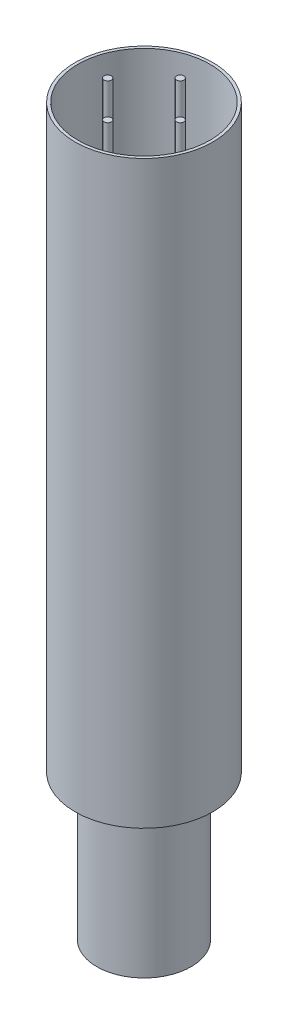
ISO-10303-21;
HEADER;
FILE_DESCRIPTION(('STEP AP214'),'2;1');
FILE_NAME('part.step','',(''),(''),'','','');
FILE_SCHEMA(('AUTOMOTIVE_DESIGN { 1 0 10303 214 1 1 1 1 }'));
ENDSEC;
DATA;
#1=APPLICATION_CONTEXT('core data for automotive mechanical design processes');
#2=APPLICATION_PROTOCOL_DEFINITION('international standard','automotive_design',2000,#1);
#3=PRODUCT_CONTEXT('',#1,'mechanical');
#4=PRODUCT('Part','Part','',(#3));
#5=PRODUCT_RELATED_PRODUCT_CATEGORY('part','',(#4));
#6=PRODUCT_DEFINITION_FORMATION('','',#4);
#7=PRODUCT_DEFINITION_CONTEXT('part definition',#1,'design');
#8=PRODUCT_DEFINITION('design','',#6,#7);
#9=PRODUCT_DEFINITION_SHAPE('','',#8);
#10=(LENGTH_UNIT() NAMED_UNIT(*) SI_UNIT(.MILLI.,.METRE.));
#11=(NAMED_UNIT(*) PLANE_ANGLE_UNIT() SI_UNIT($,.RADIAN.));
#12=(NAMED_UNIT(*) SI_UNIT($,.STERADIAN.) SOLID_ANGLE_UNIT());
#13=UNCERTAINTY_MEASURE_WITH_UNIT(LENGTH_MEASURE(1.E-05),#10,'distance_accuracy_value','');
#14=(GEOMETRIC_REPRESENTATION_CONTEXT(3) GLOBAL_UNCERTAINTY_ASSIGNED_CONTEXT((#13)) GLOBAL_UNIT_ASSIGNED_CONTEXT((#10,
#11,#12)) REPRESENTATION_CONTEXT('',''));
#15=CARTESIAN_POINT('',(0.,0.,0.));
#16=DIRECTION('',(0.,0.,1.));
#17=DIRECTION('',(1.,0.,0.));
#18=AXIS2_PLACEMENT_3D('',#15,#16,#17);
#19=CARTESIAN_POINT('',(-2.61861100413235E-13,502.,25.));
#20=DIRECTION('',(0.,-1.,0.));
#21=DIRECTION('',(0.,0.,-1.));
#22=AXIS2_PLACEMENT_3D('',#19,#20,#21);
#23=CYLINDRICAL_SURFACE('',#22,2.5);
#24=CARTESIAN_POINT('',(-2.61861100413235E-13,502.,25.));
#25=DIRECTION('',(0.,1.,0.));
#26=DIRECTION('',(0.,0.,1.));
#27=AXIS2_PLACEMENT_3D('',#24,#25,#26);
#28=CIRCLE('',#27,2.5);
#29=CARTESIAN_POINT('',(-2.61861100413235E-13,502.,27.5));
#30=VERTEX_POINT('',#29);
#31=EDGE_CURVE('E48',#30,#30,#28,.T.);
#32=ORIENTED_EDGE('',*,*,#31,.F.);
#33=EDGE_LOOP('',(#32));
#34=FACE_BOUND('',#33,.T.);
#35=CARTESIAN_POINT('',(-2.61861100413235E-13,102.,25.));
#36=DIRECTION('',(0.,1.,0.));
#37=DIRECTION('',(0.,0.,1.));
#38=AXIS2_PLACEMENT_3D('',#35,#36,#37);
#39=CIRCLE('',#38,2.5);
#40=CARTESIAN_POINT('',(-2.61861100413235E-13,102.,27.5));
#41=VERTEX_POINT('',#40);
#42=EDGE_CURVE('E11',#41,#41,#39,.T.);
#43=ORIENTED_EDGE('',*,*,#42,.T.);
#44=EDGE_LOOP('',(#43));
#45=FACE_BOUND('',#44,.T.);
#46=ADVANCED_FACE('F44',(#34,#45),#23,.T.);
#47=CARTESIAN_POINT('',(-2.61861100413235E-13,502.,25.));
#48=DIRECTION('',(0.,1.,0.));
#49=DIRECTION('',(0.,0.,1.));
#50=AXIS2_PLACEMENT_3D('',#47,#48,#49);
#51=PLANE('',#50);
#52=ORIENTED_EDGE('',*,*,#31,.T.);
#53=EDGE_LOOP('',(#52));
#54=FACE_BOUND('',#53,.T.);
#55=ADVANCED_FACE('F46',(#54),#51,.T.);
#56=CARTESIAN_POINT('',(-2.61861100413235E-13,102.,25.));
#57=DIRECTION('',(0.,1.,0.));
#58=DIRECTION('',(0.,0.,1.));
#59=AXIS2_PLACEMENT_3D('',#56,#57,#58);
#60=PLANE('',#59);
#61=ORIENTED_EDGE('',*,*,#42,.F.);
#62=EDGE_LOOP('',(#61));
#63=FACE_BOUND('',#62,.T.);
#64=ADVANCED_FACE('F63',(#63),#60,.F.);
#65=CLOSED_SHELL('',(#46,#55,#64));
#66=MANIFOLD_SOLID_BREP('B2',#65);
#67=CARTESIAN_POINT('',(25.,502.,1.74574066942157E-13));
#68=DIRECTION('',(0.,-1.,0.));
#69=DIRECTION('',(0.,0.,-1.));
#70=AXIS2_PLACEMENT_3D('',#67,#68,#69);
#71=CYLINDRICAL_SURFACE('',#70,2.5);
#72=CARTESIAN_POINT('',(25.,502.,1.74574066942157E-13));
#73=DIRECTION('',(0.,1.,0.));
#74=DIRECTION('',(0.,0.,1.));
#75=AXIS2_PLACEMENT_3D('',#72,#73,#74);
#76=CIRCLE('',#75,2.5);
#77=CARTESIAN_POINT('',(25.,502.,2.50000000000018));
#78=VERTEX_POINT('',#77);
#79=EDGE_CURVE('E103',#78,#78,#76,.T.);
#80=ORIENTED_EDGE('',*,*,#79,.F.);
#81=EDGE_LOOP('',(#80));
#82=FACE_BOUND('',#81,.T.);
#83=CARTESIAN_POINT('',(25.,102.,1.74574066942157E-13));
#84=DIRECTION('',(0.,1.,0.));
#85=DIRECTION('',(0.,0.,1.));
#86=AXIS2_PLACEMENT_3D('',#83,#84,#85);
#87=CIRCLE('',#86,2.5);
#88=CARTESIAN_POINT('',(25.,102.,2.50000000000018));
#89=VERTEX_POINT('',#88);
#90=EDGE_CURVE('E43',#89,#89,#87,.T.);
#91=ORIENTED_EDGE('',*,*,#90,.T.);
#92=EDGE_LOOP('',(#91));
#93=FACE_BOUND('',#92,.T.);
#94=ADVANCED_FACE('F99',(#82,#93),#71,.T.);
#95=CARTESIAN_POINT('',(25.,502.,1.74574066942157E-13));
#96=DIRECTION('',(0.,1.,0.));
#97=DIRECTION('',(0.,0.,1.));
#98=AXIS2_PLACEMENT_3D('',#95,#96,#97);
#99=PLANE('',#98);
#100=ORIENTED_EDGE('',*,*,#79,.T.);
#101=EDGE_LOOP('',(#100));
#102=FACE_BOUND('',#101,.T.);
#103=ADVANCED_FACE('F101',(#102),#99,.T.);
#104=CARTESIAN_POINT('',(25.,102.,1.74574066942157E-13));
#105=DIRECTION('',(0.,1.,0.));
#106=DIRECTION('',(0.,0.,1.));
#107=AXIS2_PLACEMENT_3D('',#104,#105,#106);
#108=PLANE('',#107);
#109=ORIENTED_EDGE('',*,*,#90,.F.);
#110=EDGE_LOOP('',(#109));
#111=FACE_BOUND('',#110,.T.);
#112=ADVANCED_FACE('F118',(#111),#108,.F.);
#113=CLOSED_SHELL('',(#94,#103,#112));
#114=MANIFOLD_SOLID_BREP('B6',#113);
#115=CARTESIAN_POINT('',(0.,502.,-25.));
#116=DIRECTION('',(0.,-1.,0.));
#117=DIRECTION('',(0.,0.,-1.));
#118=AXIS2_PLACEMENT_3D('',#115,#116,#117);
#119=CYLINDRICAL_SURFACE('',#118,2.5);
#120=CARTESIAN_POINT('',(0.,502.,-25.));
#121=DIRECTION('',(0.,1.,0.));
#122=DIRECTION('',(0.,0.,1.));
#123=AXIS2_PLACEMENT_3D('',#120,#121,#122);
#124=CIRCLE('',#123,2.5);
#125=CARTESIAN_POINT('',(0.,502.,-22.5));
#126=VERTEX_POINT('',#125);
#127=EDGE_CURVE('E158',#126,#126,#124,.T.);
#128=ORIENTED_EDGE('',*,*,#127,.F.);
#129=EDGE_LOOP('',(#128));
#130=FACE_BOUND('',#129,.T.);
#131=CARTESIAN_POINT('',(0.,102.,-25.));
#132=DIRECTION('',(0.,1.,0.));
#133=DIRECTION('',(0.,0.,1.));
#134=AXIS2_PLACEMENT_3D('',#131,#132,#133);
#135=CIRCLE('',#134,2.5);
#136=CARTESIAN_POINT('',(0.,102.,-22.5));
#137=VERTEX_POINT('',#136);
#138=EDGE_CURVE('E98',#137,#137,#135,.T.);
#139=ORIENTED_EDGE('',*,*,#138,.T.);
#140=EDGE_LOOP('',(#139));
#141=FACE_BOUND('',#140,.T.);
#142=ADVANCED_FACE('F154',(#130,#141),#119,.T.);
#143=CARTESIAN_POINT('',(0.,502.,-25.));
#144=DIRECTION('',(0.,1.,0.));
#145=DIRECTION('',(0.,0.,1.));
#146=AXIS2_PLACEMENT_3D('',#143,#144,#145);
#147=PLANE('',#146);
#148=ORIENTED_EDGE('',*,*,#127,.T.);
#149=EDGE_LOOP('',(#148));
#150=FACE_BOUND('',#149,.T.);
#151=ADVANCED_FACE('F156',(#150),#147,.T.);
#152=CARTESIAN_POINT('',(0.,102.,-25.));
#153=DIRECTION('',(0.,1.,0.));
#154=DIRECTION('',(0.,0.,1.));
#155=AXIS2_PLACEMENT_3D('',#152,#153,#154);
#156=PLANE('',#155);
#157=ORIENTED_EDGE('',*,*,#138,.F.);
#158=EDGE_LOOP('',(#157));
#159=FACE_BOUND('',#158,.T.);
#160=ADVANCED_FACE('F173',(#159),#156,.F.);
#161=CLOSED_SHELL('',(#142,#151,#160));
#162=MANIFOLD_SOLID_BREP('B38',#161);
#163=CARTESIAN_POINT('',(-25.,502.,0.));
#164=DIRECTION('',(0.,-1.,0.));
#165=DIRECTION('',(0.,0.,-1.));
#166=AXIS2_PLACEMENT_3D('',#163,#164,#165);
#167=CYLINDRICAL_SURFACE('',#166,2.5);
#168=CARTESIAN_POINT('',(-25.,502.,0.));
#169=DIRECTION('',(0.,1.,0.));
#170=DIRECTION('',(0.,0.,1.));
#171=AXIS2_PLACEMENT_3D('',#168,#169,#170);
#172=CIRCLE('',#171,2.5);
#173=CARTESIAN_POINT('',(-25.,502.,2.5));
#174=VERTEX_POINT('',#173);
#175=EDGE_CURVE('E153',#174,#174,#172,.T.);
#176=ORIENTED_EDGE('',*,*,#175,.F.);
#177=EDGE_LOOP('',(#176));
#178=FACE_BOUND('',#177,.T.);
#179=CARTESIAN_POINT('',(-25.,102.,0.));
#180=DIRECTION('',(0.,1.,0.));
#181=DIRECTION('',(0.,0.,1.));
#182=AXIS2_PLACEMENT_3D('',#179,#180,#181);
#183=CIRCLE('',#182,2.5);
#184=CARTESIAN_POINT('',(-25.,102.,2.5));
#185=VERTEX_POINT('',#184);
#186=EDGE_CURVE('E211',#185,#185,#183,.T.);
#187=ORIENTED_EDGE('',*,*,#186,.T.);
#188=EDGE_LOOP('',(#187));
#189=FACE_BOUND('',#188,.T.);
#190=ADVANCED_FACE('F208',(#178,#189),#167,.T.);
#191=CARTESIAN_POINT('',(-25.,502.,0.));
#192=DIRECTION('',(0.,1.,0.));
#193=DIRECTION('',(0.,0.,1.));
#194=AXIS2_PLACEMENT_3D('',#191,#192,#193);
#195=PLANE('',#194);
#196=ORIENTED_EDGE('',*,*,#175,.T.);
#197=EDGE_LOOP('',(#196));
#198=FACE_BOUND('',#197,.T.);
#199=ADVANCED_FACE('F223',(#198),#195,.T.);
#200=CARTESIAN_POINT('',(-25.,102.,0.));
#201=DIRECTION('',(0.,1.,0.));
#202=DIRECTION('',(0.,0.,1.));
#203=AXIS2_PLACEMENT_3D('',#200,#201,#202);
#204=PLANE('',#203);
#205=ORIENTED_EDGE('',*,*,#186,.F.);
#206=EDGE_LOOP('',(#205));
#207=FACE_BOUND('',#206,.T.);
#208=ADVANCED_FACE('F221',(#207),#204,.F.);
#209=CLOSED_SHELL('',(#190,#199,#208));
#210=MANIFOLD_SOLID_BREP('B93',#209);
#211=CARTESIAN_POINT('',(0.,100.,0.));
#212=DIRECTION('',(0.,-1.,0.));
#213=DIRECTION('',(0.,0.,-1.));
#214=AXIS2_PLACEMENT_3D('',#211,#212,#213);
#215=CYLINDRICAL_SURFACE('',#214,32.5);
#216=CARTESIAN_POINT('',(0.,100.,0.));
#217=DIRECTION('',(0.,1.,0.));
#218=DIRECTION('',(0.,0.,1.));
#219=AXIS2_PLACEMENT_3D('',#216,#217,#218);
#220=CIRCLE('',#219,32.5);
#221=CARTESIAN_POINT('',(0.,100.,32.5));
#222=VERTEX_POINT('',#221);
#223=EDGE_CURVE('E207',#222,#222,#220,.T.);
#224=ORIENTED_EDGE('',*,*,#223,.F.);
#225=EDGE_LOOP('',(#224));
#226=FACE_BOUND('',#225,.T.);
#227=CARTESIAN_POINT('',(0.,0.,0.));
#228=DIRECTION('',(0.,1.,0.));
#229=DIRECTION('',(0.,0.,1.));
#230=AXIS2_PLACEMENT_3D('',#227,#228,#229);
#231=CIRCLE('',#230,32.5);
#232=CARTESIAN_POINT('',(0.,0.,32.5));
#233=VERTEX_POINT('',#232);
#234=EDGE_CURVE('E258',#233,#233,#231,.T.);
#235=ORIENTED_EDGE('',*,*,#234,.T.);
#236=EDGE_LOOP('',(#235));
#237=FACE_BOUND('',#236,.T.);
#238=ADVANCED_FACE('F255',(#226,#237),#215,.T.);
#239=CARTESIAN_POINT('',(0.,0.,0.));
#240=DIRECTION('',(0.,1.,0.));
#241=DIRECTION('',(0.,0.,1.));
#242=AXIS2_PLACEMENT_3D('',#239,#240,#241);
#243=PLANE('',#242);
#244=ORIENTED_EDGE('',*,*,#234,.F.);
#245=EDGE_LOOP('',(#244));
#246=FACE_BOUND('',#245,.T.);
#247=ADVANCED_FACE('F305',(#246),#243,.F.);
#248=CARTESIAN_POINT('',(0.,500.,0.));
#249=DIRECTION('',(0.,-1.,0.));
#250=DIRECTION('',(0.,0.,-1.));
#251=AXIS2_PLACEMENT_3D('',#248,#249,#250);
#252=CYLINDRICAL_SURFACE('',#251,47.5000000000001);
#253=CARTESIAN_POINT('',(0.,500.,0.));
#254=DIRECTION('',(0.,1.,0.));
#255=DIRECTION('',(0.,0.,1.));
#256=AXIS2_PLACEMENT_3D('',#253,#254,#255);
#257=CIRCLE('',#256,47.5000000000001);
#258=CARTESIAN_POINT('',(0.,500.,47.5000000000001));
#259=VERTEX_POINT('',#258);
#260=EDGE_CURVE('E265',#259,#259,#257,.T.);
#261=ORIENTED_EDGE('',*,*,#260,.F.);
#262=EDGE_LOOP('',(#261));
#263=FACE_BOUND('',#262,.T.);
#264=CARTESIAN_POINT('',(0.,100.,0.));
#265=DIRECTION('',(0.,1.,0.));
#266=DIRECTION('',(0.,0.,1.));
#267=AXIS2_PLACEMENT_3D('',#264,#265,#266);
#268=CIRCLE('',#267,47.5000000000001);
#269=CARTESIAN_POINT('',(0.,100.,47.5000000000001));
#270=VERTEX_POINT('',#269);
#271=EDGE_CURVE('E267',#270,#270,#268,.T.);
#272=ORIENTED_EDGE('',*,*,#271,.T.);
#273=EDGE_LOOP('',(#272));
#274=FACE_BOUND('',#273,.T.);
#275=ADVANCED_FACE('F310',(#263,#274),#252,.T.);
#276=CARTESIAN_POINT('',(0.,500.,0.));
#277=DIRECTION('',(0.,1.,0.));
#278=DIRECTION('',(0.,0.,1.));
#279=AXIS2_PLACEMENT_3D('',#276,#277,#278);
#280=PLANE('',#279);
#281=CARTESIAN_POINT('',(0.,500.,0.));
#282=DIRECTION('',(0.,1.,0.));
#283=DIRECTION('',(0.,0.,1.));
#284=AXIS2_PLACEMENT_3D('',#281,#282,#283);
#285=CIRCLE('',#284,45.5000000000001);
#286=CARTESIAN_POINT('',(0.,500.,45.5000000000001));
#287=VERTEX_POINT('',#286);
#288=EDGE_CURVE('E273',#287,#287,#285,.T.);
#289=ORIENTED_EDGE('',*,*,#288,.F.);
#290=EDGE_LOOP('',(#289));
#291=FACE_BOUND('',#290,.T.);
#292=ORIENTED_EDGE('',*,*,#260,.T.);
#293=EDGE_LOOP('',(#292));
#294=FACE_BOUND('',#293,.T.);
#295=ADVANCED_FACE('F317',(#291,#294),#280,.T.);
#296=CARTESIAN_POINT('',(0.,100.,0.));
#297=DIRECTION('',(0.,1.,0.));
#298=DIRECTION('',(0.,0.,1.));
#299=AXIS2_PLACEMENT_3D('',#296,#297,#298);
#300=PLANE('',#299);
#301=ORIENTED_EDGE('',*,*,#223,.T.);
#302=EDGE_LOOP('',(#301));
#303=FACE_BOUND('',#302,.T.);
#304=ORIENTED_EDGE('',*,*,#271,.F.);
#305=EDGE_LOOP('',(#304));
#306=FACE_BOUND('',#305,.T.);
#307=ADVANCED_FACE('F321',(#303,#306),#300,.F.);
#308=CARTESIAN_POINT('',(0.,100.,0.));
#309=DIRECTION('',(0.,-1.,0.));
#310=DIRECTION('',(0.,0.,-1.));
#311=AXIS2_PLACEMENT_3D('',#308,#309,#310);
#312=CYLINDRICAL_SURFACE('',#311,30.5);
#313=CARTESIAN_POINT('',(0.,102.,0.));
#314=DIRECTION('',(0.,1.,0.));
#315=DIRECTION('',(0.,0.,1.));
#316=AXIS2_PLACEMENT_3D('',#313,#314,#315);
#317=CIRCLE('',#316,30.5);
#318=CARTESIAN_POINT('',(0.,102.,30.5));
#319=VERTEX_POINT('',#318);
#320=EDGE_CURVE('E270',#319,#319,#317,.T.);
#321=ORIENTED_EDGE('',*,*,#320,.T.);
#322=EDGE_LOOP('',(#321));
#323=FACE_BOUND('',#322,.T.);
#324=CARTESIAN_POINT('',(0.,2.,0.));
#325=DIRECTION('',(0.,1.,0.));
#326=DIRECTION('',(0.,0.,1.));
#327=AXIS2_PLACEMENT_3D('',#324,#325,#326);
#328=CIRCLE('',#327,30.5);
#329=CARTESIAN_POINT('',(0.,2.,30.5));
#330=VERTEX_POINT('',#329);
#331=EDGE_CURVE('E276',#330,#330,#328,.T.);
#332=ORIENTED_EDGE('',*,*,#331,.F.);
#333=EDGE_LOOP('',(#332));
#334=FACE_BOUND('',#333,.T.);
#335=ADVANCED_FACE('F285',(#323,#334),#312,.F.);
#336=CARTESIAN_POINT('',(0.,2.,0.));
#337=DIRECTION('',(0.,1.,0.));
#338=DIRECTION('',(0.,0.,1.));
#339=AXIS2_PLACEMENT_3D('',#336,#337,#338);
#340=PLANE('',#339);
#341=ORIENTED_EDGE('',*,*,#331,.T.);
#342=EDGE_LOOP('',(#341));
#343=FACE_BOUND('',#342,.T.);
#344=ADVANCED_FACE('F296',(#343),#340,.T.);
#345=CARTESIAN_POINT('',(0.,500.,0.));
#346=DIRECTION('',(0.,-1.,0.));
#347=DIRECTION('',(0.,0.,-1.));
#348=AXIS2_PLACEMENT_3D('',#345,#346,#347);
#349=CYLINDRICAL_SURFACE('',#348,45.5000000000001);
#350=ORIENTED_EDGE('',*,*,#288,.T.);
#351=EDGE_LOOP('',(#350));
#352=FACE_BOUND('',#351,.T.);
#353=CARTESIAN_POINT('',(0.,102.,0.));
#354=DIRECTION('',(0.,1.,0.));
#355=DIRECTION('',(0.,0.,1.));
#356=AXIS2_PLACEMENT_3D('',#353,#354,#355);
#357=CIRCLE('',#356,45.5000000000001);
#358=CARTESIAN_POINT('',(0.,102.,45.5000000000001));
#359=VERTEX_POINT('',#358);
#360=EDGE_CURVE('E277',#359,#359,#357,.T.);
#361=ORIENTED_EDGE('',*,*,#360,.F.);
#362=EDGE_LOOP('',(#361));
#363=FACE_BOUND('',#362,.T.);
#364=ADVANCED_FACE('F291',(#352,#363),#349,.F.);
#365=CARTESIAN_POINT('',(0.,102.,0.));
#366=DIRECTION('',(0.,1.,0.));
#367=DIRECTION('',(0.,0.,1.));
#368=AXIS2_PLACEMENT_3D('',#365,#366,#367);
#369=PLANE('',#368);
#370=ORIENTED_EDGE('',*,*,#320,.F.);
#371=EDGE_LOOP('',(#370));
#372=FACE_BOUND('',#371,.T.);
#373=ORIENTED_EDGE('',*,*,#360,.T.);
#374=EDGE_LOOP('',(#373));
#375=FACE_BOUND('',#374,.T.);
#376=ADVANCED_FACE('F288',(#372,#375),#369,.T.);
#377=CLOSED_SHELL('',(#238,#247,#275,#295,#307,#335,#344,#364,#376));
#378=MANIFOLD_SOLID_BREP('B148',#377);
#379=ADVANCED_BREP_SHAPE_REPRESENTATION('',(#18,#66,#114,#162,#210,#378),#14);
#380=SHAPE_DEFINITION_REPRESENTATION(#9,#379);
ENDSEC;
END-ISO-10303-21;
